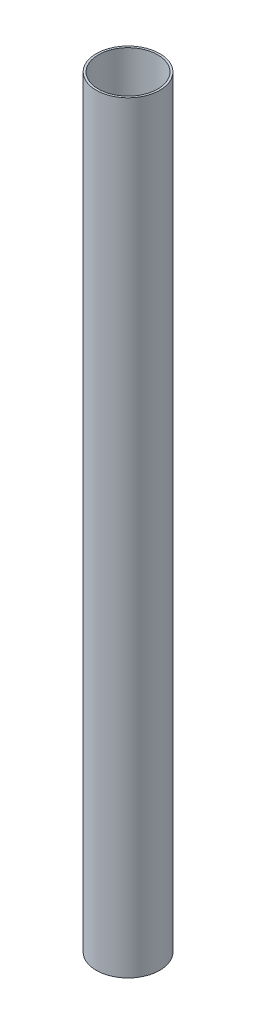
ISO-10303-21;
HEADER;
FILE_DESCRIPTION(('STEP AP214'),'2;1');
FILE_NAME('part.step','',(''),(''),'','','');
FILE_SCHEMA(('AUTOMOTIVE_DESIGN { 1 0 10303 214 1 1 1 1 }'));
ENDSEC;
DATA;
#1=APPLICATION_CONTEXT('core data for automotive mechanical design processes');
#2=APPLICATION_PROTOCOL_DEFINITION('international standard','automotive_design',2000,#1);
#3=PRODUCT_CONTEXT('',#1,'mechanical');
#4=PRODUCT('Part','Part','',(#3));
#5=PRODUCT_RELATED_PRODUCT_CATEGORY('part','',(#4));
#6=PRODUCT_DEFINITION_FORMATION('','',#4);
#7=PRODUCT_DEFINITION_CONTEXT('part definition',#1,'design');
#8=PRODUCT_DEFINITION('design','',#6,#7);
#9=PRODUCT_DEFINITION_SHAPE('','',#8);
#10=(LENGTH_UNIT() NAMED_UNIT(*) SI_UNIT(.MILLI.,.METRE.));
#11=(NAMED_UNIT(*) PLANE_ANGLE_UNIT() SI_UNIT($,.RADIAN.));
#12=(NAMED_UNIT(*) SI_UNIT($,.STERADIAN.) SOLID_ANGLE_UNIT());
#13=UNCERTAINTY_MEASURE_WITH_UNIT(LENGTH_MEASURE(1.E-05),#10,'distance_accuracy_value','');
#14=(GEOMETRIC_REPRESENTATION_CONTEXT(3) GLOBAL_UNCERTAINTY_ASSIGNED_CONTEXT((#13)) GLOBAL_UNIT_ASSIGNED_CONTEXT((#10,
#11,#12)) REPRESENTATION_CONTEXT('',''));
#15=CARTESIAN_POINT('',(0.,0.,0.));
#16=DIRECTION('',(0.,0.,1.));
#17=DIRECTION('',(1.,0.,0.));
#18=AXIS2_PLACEMENT_3D('',#15,#16,#17);
#19=CARTESIAN_POINT('',(0.,152.4,0.));
#20=DIRECTION('',(0.,1.,0.));
#21=DIRECTION('',(0.,0.,1.));
#22=AXIS2_PLACEMENT_3D('',#19,#20,#21);
#23=PLANE('',#22);
#24=CARTESIAN_POINT('',(0.,152.4,0.));
#25=DIRECTION('',(0.,1.,0.));
#26=DIRECTION('',(0.,0.,1.));
#27=AXIS2_PLACEMENT_3D('',#24,#25,#26);
#28=CIRCLE('',#27,12.7);
#29=CARTESIAN_POINT('',(0.,152.4,-12.7));
#30=VERTEX_POINT('',#29);
#31=EDGE_CURVE('E10',#30,#30,#28,.T.);
#32=ORIENTED_EDGE('',*,*,#31,.T.);
#33=EDGE_LOOP('',(#32));
#34=FACE_BOUND('',#33,.T.);
#35=CARTESIAN_POINT('',(0.,152.4,0.));
#36=DIRECTION('',(0.,1.,0.));
#37=DIRECTION('',(0.,0.,1.));
#38=AXIS2_PLACEMENT_3D('',#35,#36,#37);
#39=CIRCLE('',#38,11.8745);
#40=CARTESIAN_POINT('',(0.,152.4,-11.8745));
#41=VERTEX_POINT('',#40);
#42=EDGE_CURVE('E50',#41,#41,#39,.T.);
#43=ORIENTED_EDGE('',*,*,#42,.F.);
#44=EDGE_LOOP('',(#43));
#45=FACE_BOUND('',#44,.T.);
#46=ADVANCED_FACE('F37',(#34,#45),#23,.T.);
#47=CARTESIAN_POINT('',(0.,-152.4,0.));
#48=DIRECTION('',(0.,1.,0.));
#49=DIRECTION('',(0.,0.,1.));
#50=AXIS2_PLACEMENT_3D('',#47,#48,#49);
#51=PLANE('',#50);
#52=CARTESIAN_POINT('',(0.,-152.4,0.));
#53=DIRECTION('',(0.,1.,0.));
#54=DIRECTION('',(0.,0.,1.));
#55=AXIS2_PLACEMENT_3D('',#52,#53,#54);
#56=CIRCLE('',#55,12.7);
#57=CARTESIAN_POINT('',(0.,-152.4,-12.7));
#58=VERTEX_POINT('',#57);
#59=EDGE_CURVE('E41',#58,#58,#56,.T.);
#60=ORIENTED_EDGE('',*,*,#59,.F.);
#61=EDGE_LOOP('',(#60));
#62=FACE_BOUND('',#61,.T.);
#63=CARTESIAN_POINT('',(0.,-152.4,0.));
#64=DIRECTION('',(0.,1.,0.));
#65=DIRECTION('',(0.,0.,1.));
#66=AXIS2_PLACEMENT_3D('',#63,#64,#65);
#67=CIRCLE('',#66,11.8745);
#68=CARTESIAN_POINT('',(0.,-152.4,-11.8745));
#69=VERTEX_POINT('',#68);
#70=EDGE_CURVE('E52',#69,#69,#67,.T.);
#71=ORIENTED_EDGE('',*,*,#70,.T.);
#72=EDGE_LOOP('',(#71));
#73=FACE_BOUND('',#72,.T.);
#74=ADVANCED_FACE('F64',(#62,#73),#51,.F.);
#75=CARTESIAN_POINT('',(0.,152.4,0.));
#76=DIRECTION('',(0.,-1.,0.));
#77=DIRECTION('',(0.,0.,-1.));
#78=AXIS2_PLACEMENT_3D('',#75,#76,#77);
#79=CYLINDRICAL_SURFACE('',#78,12.7);
#80=CARTESIAN_POINT('',(0.,152.4,-12.7));
#81=CARTESIAN_POINT('',(0.,149.225,-12.7));
#82=CARTESIAN_POINT('',(0.,146.05,-12.7));
#83=CARTESIAN_POINT('',(0.,139.7,-12.7));
#84=CARTESIAN_POINT('',(0.,136.525,-12.7));
#85=CARTESIAN_POINT('',(0.,130.175,-12.7));
#86=CARTESIAN_POINT('',(0.,127.,-12.7));
#87=CARTESIAN_POINT('',(0.,120.65,-12.7));
#88=CARTESIAN_POINT('',(0.,117.475,-12.7));
#89=CARTESIAN_POINT('',(0.,111.125,-12.7));
#90=CARTESIAN_POINT('',(0.,107.95,-12.7));
#91=CARTESIAN_POINT('',(0.,101.6,-12.7));
#92=CARTESIAN_POINT('',(0.,98.425,-12.7));
#93=CARTESIAN_POINT('',(0.,92.075,-12.7));
#94=CARTESIAN_POINT('',(0.,88.9,-12.7));
#95=CARTESIAN_POINT('',(0.,82.55,-12.7));
#96=CARTESIAN_POINT('',(0.,79.375,-12.7));
#97=CARTESIAN_POINT('',(0.,73.025,-12.7));
#98=CARTESIAN_POINT('',(0.,69.85,-12.7));
#99=CARTESIAN_POINT('',(0.,63.5,-12.7));
#100=CARTESIAN_POINT('',(0.,60.325,-12.7));
#101=CARTESIAN_POINT('',(0.,53.975,-12.7));
#102=CARTESIAN_POINT('',(0.,50.8,-12.7));
#103=CARTESIAN_POINT('',(0.,44.45,-12.7));
#104=CARTESIAN_POINT('',(0.,41.275,-12.7));
#105=CARTESIAN_POINT('',(0.,34.925,-12.7));
#106=CARTESIAN_POINT('',(0.,31.75,-12.7));
#107=CARTESIAN_POINT('',(0.,25.4,-12.7));
#108=CARTESIAN_POINT('',(0.,22.225,-12.7));
#109=CARTESIAN_POINT('',(0.,15.875,-12.7));
#110=CARTESIAN_POINT('',(0.,12.7,-12.7));
#111=CARTESIAN_POINT('',(0.,6.35,-12.7));
#112=CARTESIAN_POINT('',(0.,3.175,-12.7));
#113=CARTESIAN_POINT('',(0.,-3.175,-12.7));
#114=CARTESIAN_POINT('',(0.,-6.35,-12.7));
#115=CARTESIAN_POINT('',(0.,-12.7,-12.7));
#116=CARTESIAN_POINT('',(0.,-15.875,-12.7));
#117=CARTESIAN_POINT('',(0.,-22.225,-12.7));
#118=CARTESIAN_POINT('',(0.,-25.4,-12.7));
#119=CARTESIAN_POINT('',(0.,-31.75,-12.7));
#120=CARTESIAN_POINT('',(0.,-34.925,-12.7));
#121=CARTESIAN_POINT('',(0.,-41.275,-12.7));
#122=CARTESIAN_POINT('',(0.,-44.45,-12.7));
#123=CARTESIAN_POINT('',(0.,-50.8,-12.7));
#124=CARTESIAN_POINT('',(0.,-53.975,-12.7));
#125=CARTESIAN_POINT('',(0.,-60.325,-12.7));
#126=CARTESIAN_POINT('',(0.,-63.5,-12.7));
#127=CARTESIAN_POINT('',(0.,-69.85,-12.7));
#128=CARTESIAN_POINT('',(0.,-73.025,-12.7));
#129=CARTESIAN_POINT('',(0.,-79.375,-12.7));
#130=CARTESIAN_POINT('',(0.,-82.55,-12.7));
#131=CARTESIAN_POINT('',(0.,-88.9,-12.7));
#132=CARTESIAN_POINT('',(0.,-92.075,-12.7));
#133=CARTESIAN_POINT('',(0.,-98.425,-12.7));
#134=CARTESIAN_POINT('',(0.,-101.6,-12.7));
#135=CARTESIAN_POINT('',(0.,-107.95,-12.7));
#136=CARTESIAN_POINT('',(0.,-111.125,-12.7));
#137=CARTESIAN_POINT('',(0.,-117.475,-12.7));
#138=CARTESIAN_POINT('',(0.,-120.65,-12.7));
#139=CARTESIAN_POINT('',(0.,-127.,-12.7));
#140=CARTESIAN_POINT('',(0.,-130.175,-12.7));
#141=CARTESIAN_POINT('',(0.,-136.525,-12.7));
#142=CARTESIAN_POINT('',(0.,-139.7,-12.7));
#143=CARTESIAN_POINT('',(0.,-146.05,-12.7));
#144=CARTESIAN_POINT('',(0.,-149.225,-12.7));
#145=CARTESIAN_POINT('',(0.,-152.4,-12.7));
#146=B_SPLINE_CURVE_WITH_KNOTS('',3,(#80,#81,#82,#83,#84,#85,#86,#87,#88,#89,#90,#91,#92,#93,
#94,#95,#96,#97,#98,#99,#100,#101,#102,#103,#104,#105,#106,#107,#108,#109,#110,#111,#112,#113,
#114,#115,#116,#117,#118,#119,#120,#121,#122,#123,#124,#125,#126,#127,#128,#129,#130,#131,#132,
#133,#134,#135,#136,#137,#138,#139,#140,#141,#142,#143,#144,#145),.UNSPECIFIED.,.F.,.F.,(4,2,2,
2,2,2,2,2,2,2,2,2,2,2,2,2,2,2,2,2,2,2,2,2,2,2,2,2,2,2,2,2,4),(0.,9.52500000000001,19.05,28.575,
38.1,47.625,57.15,66.675,76.2,85.725,95.25,104.775,114.3,123.825,133.35,142.875,152.4,161.925,
171.45,180.975,190.5,200.025,209.55,219.075,228.6,238.125,247.65,257.175,266.7,276.225,285.75,
295.275,304.8),.UNSPECIFIED.);
#147=EDGE_CURVE('BSEAM39',#30,#58,#146,.T.);
#148=ORIENTED_EDGE('',*,*,#31,.F.);
#149=ORIENTED_EDGE('',*,*,#59,.T.);
#150=ORIENTED_EDGE('',*,*,#147,.T.);
#151=ORIENTED_EDGE('',*,*,#147,.F.);
#152=EDGE_LOOP('',(#148,#150,#149,#151));
#153=FACE_BOUND('',#152,.T.);
#154=ADVANCED_FACE('F39',(#153),#79,.T.);
#155=CARTESIAN_POINT('',(0.,152.4,0.));
#156=DIRECTION('',(0.,-1.,0.));
#157=DIRECTION('',(0.,0.,-1.));
#158=AXIS2_PLACEMENT_3D('',#155,#156,#157);
#159=CYLINDRICAL_SURFACE('',#158,11.8745);
#160=CARTESIAN_POINT('',(0.,152.4,-11.8745));
#161=CARTESIAN_POINT('',(0.,149.225,-11.8745));
#162=CARTESIAN_POINT('',(0.,146.05,-11.8745));
#163=CARTESIAN_POINT('',(0.,139.7,-11.8745));
#164=CARTESIAN_POINT('',(0.,136.525,-11.8745));
#165=CARTESIAN_POINT('',(0.,130.175,-11.8745));
#166=CARTESIAN_POINT('',(0.,127.,-11.8745));
#167=CARTESIAN_POINT('',(0.,120.65,-11.8745));
#168=CARTESIAN_POINT('',(0.,117.475,-11.8745));
#169=CARTESIAN_POINT('',(0.,111.125,-11.8745));
#170=CARTESIAN_POINT('',(0.,107.95,-11.8745));
#171=CARTESIAN_POINT('',(0.,101.6,-11.8745));
#172=CARTESIAN_POINT('',(0.,98.425,-11.8745));
#173=CARTESIAN_POINT('',(0.,92.075,-11.8745));
#174=CARTESIAN_POINT('',(0.,88.9,-11.8745));
#175=CARTESIAN_POINT('',(0.,82.55,-11.8745));
#176=CARTESIAN_POINT('',(0.,79.375,-11.8745));
#177=CARTESIAN_POINT('',(0.,73.025,-11.8745));
#178=CARTESIAN_POINT('',(0.,69.85,-11.8745));
#179=CARTESIAN_POINT('',(0.,63.5,-11.8745));
#180=CARTESIAN_POINT('',(0.,60.325,-11.8745));
#181=CARTESIAN_POINT('',(0.,53.975,-11.8745));
#182=CARTESIAN_POINT('',(0.,50.8,-11.8745));
#183=CARTESIAN_POINT('',(0.,44.45,-11.8745));
#184=CARTESIAN_POINT('',(0.,41.275,-11.8745));
#185=CARTESIAN_POINT('',(0.,34.925,-11.8745));
#186=CARTESIAN_POINT('',(0.,31.75,-11.8745));
#187=CARTESIAN_POINT('',(0.,25.4,-11.8745));
#188=CARTESIAN_POINT('',(0.,22.225,-11.8745));
#189=CARTESIAN_POINT('',(0.,15.875,-11.8745));
#190=CARTESIAN_POINT('',(0.,12.7,-11.8745));
#191=CARTESIAN_POINT('',(0.,6.35,-11.8745));
#192=CARTESIAN_POINT('',(0.,3.175,-11.8745));
#193=CARTESIAN_POINT('',(0.,-3.175,-11.8745));
#194=CARTESIAN_POINT('',(0.,-6.35,-11.8745));
#195=CARTESIAN_POINT('',(0.,-12.7,-11.8745));
#196=CARTESIAN_POINT('',(0.,-15.875,-11.8745));
#197=CARTESIAN_POINT('',(0.,-22.225,-11.8745));
#198=CARTESIAN_POINT('',(0.,-25.4,-11.8745));
#199=CARTESIAN_POINT('',(0.,-31.75,-11.8745));
#200=CARTESIAN_POINT('',(0.,-34.925,-11.8745));
#201=CARTESIAN_POINT('',(0.,-41.275,-11.8745));
#202=CARTESIAN_POINT('',(0.,-44.45,-11.8745));
#203=CARTESIAN_POINT('',(0.,-50.8,-11.8745));
#204=CARTESIAN_POINT('',(0.,-53.975,-11.8745));
#205=CARTESIAN_POINT('',(0.,-60.325,-11.8745));
#206=CARTESIAN_POINT('',(0.,-63.5,-11.8745));
#207=CARTESIAN_POINT('',(0.,-69.85,-11.8745));
#208=CARTESIAN_POINT('',(0.,-73.025,-11.8745));
#209=CARTESIAN_POINT('',(0.,-79.375,-11.8745));
#210=CARTESIAN_POINT('',(0.,-82.55,-11.8745));
#211=CARTESIAN_POINT('',(0.,-88.9,-11.8745));
#212=CARTESIAN_POINT('',(0.,-92.075,-11.8745));
#213=CARTESIAN_POINT('',(0.,-98.425,-11.8745));
#214=CARTESIAN_POINT('',(0.,-101.6,-11.8745));
#215=CARTESIAN_POINT('',(0.,-107.95,-11.8745));
#216=CARTESIAN_POINT('',(0.,-111.125,-11.8745));
#217=CARTESIAN_POINT('',(0.,-117.475,-11.8745));
#218=CARTESIAN_POINT('',(0.,-120.65,-11.8745));
#219=CARTESIAN_POINT('',(0.,-127.,-11.8745));
#220=CARTESIAN_POINT('',(0.,-130.175,-11.8745));
#221=CARTESIAN_POINT('',(0.,-136.525,-11.8745));
#222=CARTESIAN_POINT('',(0.,-139.7,-11.8745));
#223=CARTESIAN_POINT('',(0.,-146.05,-11.8745));
#224=CARTESIAN_POINT('',(0.,-149.225,-11.8745));
#225=CARTESIAN_POINT('',(0.,-152.4,-11.8745));
#226=B_SPLINE_CURVE_WITH_KNOTS('',3,(#160,#161,#162,#163,#164,#165,#166,#167,#168,#169,#170,
#171,#172,#173,#174,#175,#176,#177,#178,#179,#180,#181,#182,#183,#184,#185,#186,#187,#188,#189,
#190,#191,#192,#193,#194,#195,#196,#197,#198,#199,#200,#201,#202,#203,#204,#205,#206,#207,#208,
#209,#210,#211,#212,#213,#214,#215,#216,#217,#218,#219,#220,#221,#222,#223,#224,#225),
.UNSPECIFIED.,.F.,.F.,(4,2,2,2,2,2,2,2,2,2,2,2,2,2,2,2,2,2,2,2,2,2,2,2,2,2,2,2,2,2,2,2,4),(0.,
9.52500000000001,19.05,28.575,38.1,47.625,57.15,66.675,76.2,85.725,95.25,104.775,114.3,123.825,
133.35,142.875,152.4,161.925,171.45,180.975,190.5,200.025,209.55,219.075,228.6,238.125,247.65,
257.175,266.7,276.225,285.75,295.275,304.8),.UNSPECIFIED.);
#227=EDGE_CURVE('BSEAM60',#41,#69,#226,.T.);
#228=ORIENTED_EDGE('',*,*,#42,.T.);
#229=ORIENTED_EDGE('',*,*,#70,.F.);
#230=ORIENTED_EDGE('',*,*,#227,.T.);
#231=ORIENTED_EDGE('',*,*,#227,.F.);
#232=EDGE_LOOP('',(#228,#230,#229,#231));
#233=FACE_BOUND('',#232,.T.);
#234=ADVANCED_FACE('F60',(#233),#159,.F.);
#235=CLOSED_SHELL('',(#46,#74,#154,#234));
#236=MANIFOLD_SOLID_BREP('B2',#235);
#237=ADVANCED_BREP_SHAPE_REPRESENTATION('',(#18,#236),#14);
#238=SHAPE_DEFINITION_REPRESENTATION(#9,#237);
ENDSEC;
END-ISO-10303-21;
